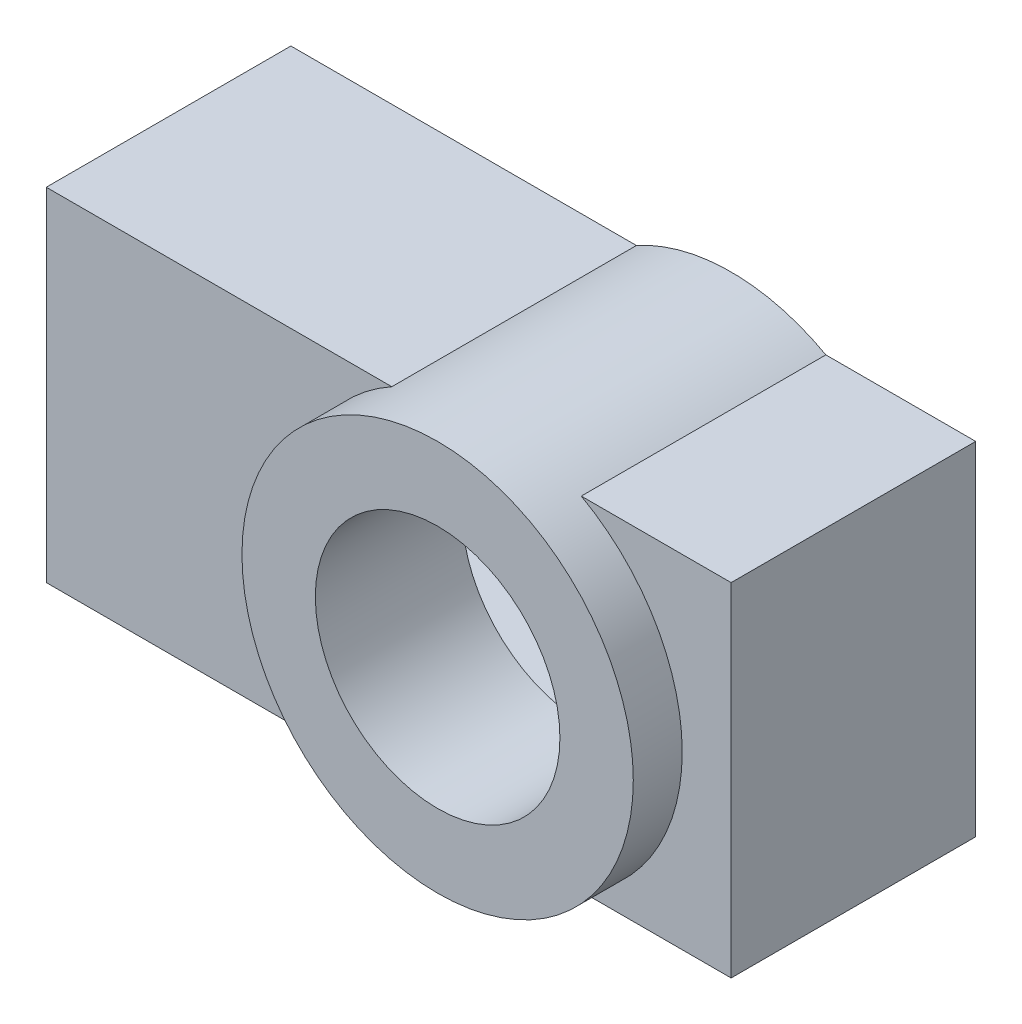
ISO-10303-21;
HEADER;
FILE_DESCRIPTION(('STEP AP214'),'2;1');
FILE_NAME('part.step','',(''),(''),'','','');
FILE_SCHEMA(('AUTOMOTIVE_DESIGN { 1 0 10303 214 1 1 1 1 }'));
ENDSEC;
DATA;
#1=APPLICATION_CONTEXT('core data for automotive mechanical design processes');
#2=APPLICATION_PROTOCOL_DEFINITION('international standard','automotive_design',2000,#1);
#3=PRODUCT_CONTEXT('',#1,'mechanical');
#4=PRODUCT('Part','Part','',(#3));
#5=PRODUCT_RELATED_PRODUCT_CATEGORY('part','',(#4));
#6=PRODUCT_DEFINITION_FORMATION('','',#4);
#7=PRODUCT_DEFINITION_CONTEXT('part definition',#1,'design');
#8=PRODUCT_DEFINITION('design','',#6,#7);
#9=PRODUCT_DEFINITION_SHAPE('','',#8);
#10=(LENGTH_UNIT() NAMED_UNIT(*) SI_UNIT(.MILLI.,.METRE.));
#11=(NAMED_UNIT(*) PLANE_ANGLE_UNIT() SI_UNIT($,.RADIAN.));
#12=(NAMED_UNIT(*) SI_UNIT($,.STERADIAN.) SOLID_ANGLE_UNIT());
#13=UNCERTAINTY_MEASURE_WITH_UNIT(LENGTH_MEASURE(1.E-05),#10,'distance_accuracy_value','');
#14=(GEOMETRIC_REPRESENTATION_CONTEXT(3) GLOBAL_UNCERTAINTY_ASSIGNED_CONTEXT((#13)) GLOBAL_UNIT_ASSIGNED_CONTEXT((#10,
#11,#12)) REPRESENTATION_CONTEXT('',''));
#15=CARTESIAN_POINT('',(0.,0.,0.));
#16=DIRECTION('',(0.,0.,1.));
#17=DIRECTION('',(1.,0.,0.));
#18=AXIS2_PLACEMENT_3D('',#15,#16,#17);
#19=CARTESIAN_POINT('',(14.,0.,-1.));
#20=DIRECTION('',(0.,0.,1.));
#21=DIRECTION('',(1.,0.,0.));
#22=AXIS2_PLACEMENT_3D('',#19,#20,#21);
#23=PLANE('',#22);
#24=DIRECTION('',(-1.,0.,0.));
#25=VECTOR('',#24,1.);
#26=CARTESIAN_POINT('',(14.,-2.5,-1.));
#27=LINE('',#26,#25);
#28=CARTESIAN_POINT('',(12.,-2.5,-1.));
#29=VERTEX_POINT('',#28);
#30=CARTESIAN_POINT('',(9.,-2.5,-0.999999999999999));
#31=VERTEX_POINT('',#30);
#32=EDGE_CURVE('E148',#29,#31,#27,.T.);
#33=ORIENTED_EDGE('',*,*,#32,.F.);
#34=DIRECTION('',(0.,1.,0.));
#35=VECTOR('',#34,1.);
#36=CARTESIAN_POINT('',(12.,2.5,-1.));
#37=LINE('',#36,#35);
#38=CARTESIAN_POINT('',(12.,2.5,-1.));
#39=VERTEX_POINT('',#38);
#40=EDGE_CURVE('E147',#29,#39,#37,.T.);
#41=ORIENTED_EDGE('',*,*,#40,.T.);
#42=DIRECTION('',(-1.,0.,0.));
#43=VECTOR('',#42,1.);
#44=CARTESIAN_POINT('',(14.,2.5,-1.));
#45=LINE('',#44,#43);
#46=CARTESIAN_POINT('',(9.,2.5,-0.999999999999999));
#47=VERTEX_POINT('',#46);
#48=EDGE_CURVE('E134',#39,#47,#45,.T.);
#49=ORIENTED_EDGE('',*,*,#48,.T.);
#50=CARTESIAN_POINT('',(9.,0.,-0.999999999999999));
#51=DIRECTION('',(0.,0.,-1.));
#52=DIRECTION('',(-1.,0.,0.));
#53=AXIS2_PLACEMENT_3D('',#50,#51,#52);
#54=CIRCLE('',#53,2.5);
#55=EDGE_CURVE('E155',#31,#47,#54,.F.);
#56=ORIENTED_EDGE('',*,*,#55,.F.);
#57=EDGE_LOOP('',(#33,#41,#49,#56));
#58=FACE_BOUND('',#57,.T.);
#59=ADVANCED_FACE('F34',(#58),#23,.T.);
#60=CARTESIAN_POINT('',(14.,-2.5,0.));
#61=DIRECTION('',(0.,1.,0.));
#62=DIRECTION('',(0.,0.,1.));
#63=AXIS2_PLACEMENT_3D('',#60,#61,#62);
#64=PLANE('',#63);
#65=DIRECTION('',(-1.,0.,0.));
#66=VECTOR('',#65,1.);
#67=CARTESIAN_POINT('',(14.,-2.5,1.));
#68=LINE('',#67,#66);
#69=CARTESIAN_POINT('',(12.,-2.5,1.));
#70=VERTEX_POINT('',#69);
#71=CARTESIAN_POINT('',(9.,-2.5,1.));
#72=VERTEX_POINT('',#71);
#73=EDGE_CURVE('E235',#70,#72,#68,.T.);
#74=ORIENTED_EDGE('',*,*,#73,.F.);
#75=DIRECTION('',(0.,0.,-1.));
#76=VECTOR('',#75,1.);
#77=CARTESIAN_POINT('',(12.,-2.5,1.));
#78=LINE('',#77,#76);
#79=EDGE_CURVE('E48',#70,#29,#78,.T.);
#80=ORIENTED_EDGE('',*,*,#79,.T.);
#81=ORIENTED_EDGE('',*,*,#32,.T.);
#82=CARTESIAN_POINT('',(0.,-2.5,-1.));
#83=VERTEX_POINT('',#82);
#84=EDGE_CURVE('E237',#31,#83,#27,.T.);
#85=ORIENTED_EDGE('',*,*,#84,.T.);
#86=DIRECTION('',(0.,0.,-1.));
#87=VECTOR('',#86,1.);
#88=CARTESIAN_POINT('',(0.,-2.5,0.));
#89=LINE('',#88,#87);
#90=CARTESIAN_POINT('',(0.,-2.5,1.));
#91=VERTEX_POINT('',#90);
#92=EDGE_CURVE('E196',#91,#83,#89,.T.);
#93=ORIENTED_EDGE('',*,*,#92,.F.);
#94=EDGE_CURVE('E234',#72,#91,#68,.T.);
#95=ORIENTED_EDGE('',*,*,#94,.F.);
#96=EDGE_LOOP('',(#74,#80,#81,#85,#93,#95));
#97=FACE_BOUND('',#96,.T.);
#98=ADVANCED_FACE('F291',(#97),#64,.T.);
#99=CARTESIAN_POINT('',(14.,0.,1.));
#100=DIRECTION('',(0.,0.,1.));
#101=DIRECTION('',(1.,0.,0.));
#102=AXIS2_PLACEMENT_3D('',#99,#100,#101);
#103=PLANE('',#102);
#104=DIRECTION('',(0.,-1.,0.));
#105=VECTOR('',#104,1.);
#106=CARTESIAN_POINT('',(12.,2.5,1.));
#107=LINE('',#106,#105);
#108=CARTESIAN_POINT('',(12.,2.5,1.));
#109=VERTEX_POINT('',#108);
#110=EDGE_CURVE('E56',#109,#70,#107,.T.);
#111=ORIENTED_EDGE('',*,*,#110,.T.);
#112=ORIENTED_EDGE('',*,*,#73,.T.);
#113=CARTESIAN_POINT('',(9.,0.,1.));
#114=DIRECTION('',(0.,0.,1.));
#115=DIRECTION('',(1.,0.,0.));
#116=AXIS2_PLACEMENT_3D('',#113,#114,#115);
#117=CIRCLE('',#116,2.5);
#118=CARTESIAN_POINT('',(9.,2.5,1.));
#119=VERTEX_POINT('',#118);
#120=EDGE_CURVE('E159',#119,#72,#117,.F.);
#121=ORIENTED_EDGE('',*,*,#120,.F.);
#122=DIRECTION('',(-1.,0.,0.));
#123=VECTOR('',#122,1.);
#124=CARTESIAN_POINT('',(14.,2.5,1.));
#125=LINE('',#124,#123);
#126=EDGE_CURVE('E232',#109,#119,#125,.T.);
#127=ORIENTED_EDGE('',*,*,#126,.F.);
#128=EDGE_LOOP('',(#111,#112,#121,#127));
#129=FACE_BOUND('',#128,.T.);
#130=ADVANCED_FACE('F296',(#129),#103,.F.);
#131=CARTESIAN_POINT('',(14.,2.5,0.));
#132=DIRECTION('',(0.,1.,0.));
#133=DIRECTION('',(0.,0.,1.));
#134=AXIS2_PLACEMENT_3D('',#131,#132,#133);
#135=PLANE('',#134);
#136=DIRECTION('',(0.,0.,1.));
#137=VECTOR('',#136,1.);
#138=CARTESIAN_POINT('',(12.,2.5,1.));
#139=LINE('',#138,#137);
#140=EDGE_CURVE('E138',#39,#109,#139,.T.);
#141=ORIENTED_EDGE('',*,*,#140,.T.);
#142=ORIENTED_EDGE('',*,*,#126,.T.);
#143=CARTESIAN_POINT('',(0.,2.5,1.));
#144=VERTEX_POINT('',#143);
#145=EDGE_CURVE('E144',#119,#144,#125,.T.);
#146=ORIENTED_EDGE('',*,*,#145,.T.);
#147=DIRECTION('',(0.,0.,-1.));
#148=VECTOR('',#147,1.);
#149=CARTESIAN_POINT('',(0.,2.5,0.));
#150=LINE('',#149,#148);
#151=CARTESIAN_POINT('',(0.,2.5,-1.));
#152=VERTEX_POINT('',#151);
#153=EDGE_CURVE('E202',#144,#152,#150,.T.);
#154=ORIENTED_EDGE('',*,*,#153,.T.);
#155=EDGE_CURVE('E140',#47,#152,#45,.T.);
#156=ORIENTED_EDGE('',*,*,#155,.F.);
#157=ORIENTED_EDGE('',*,*,#48,.F.);
#158=EDGE_LOOP('',(#141,#142,#146,#154,#156,#157));
#159=FACE_BOUND('',#158,.T.);
#160=ADVANCED_FACE('F136',(#159),#135,.F.);
#161=CARTESIAN_POINT('',(9.,0.,-11.));
#162=DIRECTION('',(0.,0.,1.));
#163=DIRECTION('',(1.,0.,0.));
#164=AXIS2_PLACEMENT_3D('',#161,#162,#163);
#165=CYLINDRICAL_SURFACE('',#164,2.5);
#166=EDGE_CURVE('E152',#47,#31,#54,.F.);
#167=ORIENTED_EDGE('',*,*,#166,.T.);
#168=ORIENTED_EDGE('',*,*,#55,.T.);
#169=EDGE_LOOP('',(#167,#168));
#170=FACE_BOUND('',#169,.T.);
#171=CARTESIAN_POINT('',(9.,0.,-1.5));
#172=DIRECTION('',(0.,0.,-1.));
#173=DIRECTION('',(-1.,0.,0.));
#174=AXIS2_PLACEMENT_3D('',#171,#172,#173);
#175=CIRCLE('',#174,2.5);
#176=CARTESIAN_POINT('',(6.5,0.,-1.5));
#177=VERTEX_POINT('',#176);
#178=EDGE_CURVE('E11',#177,#177,#175,.F.);
#179=ORIENTED_EDGE('',*,*,#178,.F.);
#180=EDGE_LOOP('',(#179));
#181=FACE_BOUND('',#180,.T.);
#182=ADVANCED_FACE('F311',(#170,#181),#165,.F.);
#183=CARTESIAN_POINT('',(9.,0.,4.));
#184=DIRECTION('',(0.,0.,1.));
#185=DIRECTION('',(1.,0.,0.));
#186=AXIS2_PLACEMENT_3D('',#183,#184,#185);
#187=CIRCLE('',#186,2.5);
#188=CARTESIAN_POINT('',(11.5,0.,4.));
#189=VERTEX_POINT('',#188);
#190=EDGE_CURVE('E163',#189,#189,#187,.T.);
#191=ORIENTED_EDGE('',*,*,#190,.T.);
#192=EDGE_LOOP('',(#191));
#193=FACE_BOUND('',#192,.T.);
#194=ORIENTED_EDGE('',*,*,#120,.T.);
#195=EDGE_CURVE('E162',#72,#119,#117,.F.);
#196=ORIENTED_EDGE('',*,*,#195,.T.);
#197=EDGE_LOOP('',(#194,#196));
#198=FACE_BOUND('',#197,.T.);
#199=ADVANCED_FACE('F314',(#193,#198),#165,.F.);
#200=CARTESIAN_POINT('',(14.,-3.5,0.));
#201=DIRECTION('',(0.,1.,0.));
#202=DIRECTION('',(0.,0.,1.));
#203=AXIS2_PLACEMENT_3D('',#200,#201,#202);
#204=PLANE('',#203);
#205=DIRECTION('',(-1.,0.,0.));
#206=VECTOR('',#205,1.);
#207=CARTESIAN_POINT('',(14.,-3.5,-2.));
#208=LINE('',#207,#206);
#209=CARTESIAN_POINT('',(7.06350832689629,-3.5,-2.));
#210=VERTEX_POINT('',#209);
#211=CARTESIAN_POINT('',(0.,-3.5,-2.));
#212=VERTEX_POINT('',#211);
#213=EDGE_CURVE('E227',#210,#212,#208,.T.);
#214=ORIENTED_EDGE('',*,*,#213,.F.);
#215=DIRECTION('',(0.,0.,1.));
#216=VECTOR('',#215,1.);
#217=CARTESIAN_POINT('',(7.06350832689629,-3.5,-2.));
#218=LINE('',#217,#216);
#219=CARTESIAN_POINT('',(7.06350832689629,-3.5,3.));
#220=VERTEX_POINT('',#219);
#221=EDGE_CURVE('E174',#210,#220,#218,.T.);
#222=ORIENTED_EDGE('',*,*,#221,.T.);
#223=DIRECTION('',(-1.,0.,0.));
#224=VECTOR('',#223,1.);
#225=CARTESIAN_POINT('',(14.,-3.5,3.));
#226=LINE('',#225,#224);
#227=CARTESIAN_POINT('',(0.,-3.5,3.));
#228=VERTEX_POINT('',#227);
#229=EDGE_CURVE('E219',#220,#228,#226,.T.);
#230=ORIENTED_EDGE('',*,*,#229,.T.);
#231=DIRECTION('',(0.,0.,-1.));
#232=VECTOR('',#231,1.);
#233=CARTESIAN_POINT('',(0.,-3.5,0.));
#234=LINE('',#233,#232);
#235=EDGE_CURVE('E204',#228,#212,#234,.T.);
#236=ORIENTED_EDGE('',*,*,#235,.T.);
#237=EDGE_LOOP('',(#214,#222,#230,#236));
#238=FACE_BOUND('',#237,.T.);
#239=ADVANCED_FACE('F272',(#238),#204,.F.);
#240=CARTESIAN_POINT('',(14.,3.5,0.));
#241=DIRECTION('',(0.,1.,0.));
#242=DIRECTION('',(0.,0.,1.));
#243=AXIS2_PLACEMENT_3D('',#240,#241,#242);
#244=PLANE('',#243);
#245=DIRECTION('',(0.,0.,1.));
#246=VECTOR('',#245,1.);
#247=CARTESIAN_POINT('',(7.06350832689629,3.5,-2.));
#248=LINE('',#247,#246);
#249=CARTESIAN_POINT('',(7.06350832689629,3.5,-2.));
#250=VERTEX_POINT('',#249);
#251=CARTESIAN_POINT('',(7.06350832689629,3.5,3.));
#252=VERTEX_POINT('',#251);
#253=EDGE_CURVE('E172',#250,#252,#248,.T.);
#254=ORIENTED_EDGE('',*,*,#253,.F.);
#255=DIRECTION('',(-1.,0.,0.));
#256=VECTOR('',#255,1.);
#257=CARTESIAN_POINT('',(14.,3.5,-2.));
#258=LINE('',#257,#256);
#259=CARTESIAN_POINT('',(0.,3.5,-2.));
#260=VERTEX_POINT('',#259);
#261=EDGE_CURVE('E223',#250,#260,#258,.T.);
#262=ORIENTED_EDGE('',*,*,#261,.T.);
#263=DIRECTION('',(0.,0.,-1.));
#264=VECTOR('',#263,1.);
#265=CARTESIAN_POINT('',(0.,3.5,0.));
#266=LINE('',#265,#264);
#267=CARTESIAN_POINT('',(0.,3.5,3.));
#268=VERTEX_POINT('',#267);
#269=EDGE_CURVE('E210',#268,#260,#266,.T.);
#270=ORIENTED_EDGE('',*,*,#269,.F.);
#271=DIRECTION('',(-1.,0.,0.));
#272=VECTOR('',#271,1.);
#273=CARTESIAN_POINT('',(14.,3.5,3.));
#274=LINE('',#273,#272);
#275=EDGE_CURVE('E218',#252,#268,#274,.T.);
#276=ORIENTED_EDGE('',*,*,#275,.F.);
#277=EDGE_LOOP('',(#254,#262,#270,#276));
#278=FACE_BOUND('',#277,.T.);
#279=ADVANCED_FACE('F268',(#278),#244,.T.);
#280=CARTESIAN_POINT('',(14.,0.,3.));
#281=DIRECTION('',(0.,0.,-1.));
#282=DIRECTION('',(0.,1.,0.));
#283=AXIS2_PLACEMENT_3D('',#280,#281,#282);
#284=PLANE('',#283);
#285=CARTESIAN_POINT('',(14.,3.5,3.));
#286=VERTEX_POINT('',#285);
#287=CARTESIAN_POINT('',(10.9364916731037,3.5,3.));
#288=VERTEX_POINT('',#287);
#289=EDGE_CURVE('E220',#286,#288,#274,.T.);
#290=ORIENTED_EDGE('',*,*,#289,.T.);
#291=CARTESIAN_POINT('',(9.,0.,3.));
#292=DIRECTION('',(0.,0.,-1.));
#293=DIRECTION('',(0.,1.,0.));
#294=AXIS2_PLACEMENT_3D('',#291,#292,#293);
#295=CIRCLE('',#294,4.);
#296=CARTESIAN_POINT('',(10.9364916731037,-3.5,3.));
#297=VERTEX_POINT('',#296);
#298=EDGE_CURVE('E41',#288,#297,#295,.T.);
#299=ORIENTED_EDGE('',*,*,#298,.T.);
#300=CARTESIAN_POINT('',(14.,-3.5,3.));
#301=VERTEX_POINT('',#300);
#302=EDGE_CURVE('E215',#301,#297,#226,.T.);
#303=ORIENTED_EDGE('',*,*,#302,.F.);
#304=DIRECTION('',(0.,-1.,0.));
#305=VECTOR('',#304,1.);
#306=CARTESIAN_POINT('',(14.,0.,3.));
#307=LINE('',#306,#305);
#308=EDGE_CURVE('E192',#286,#301,#307,.T.);
#309=ORIENTED_EDGE('',*,*,#308,.F.);
#310=EDGE_LOOP('',(#290,#299,#303,#309));
#311=FACE_BOUND('',#310,.T.);
#312=ADVANCED_FACE('F245',(#311),#284,.F.);
#313=ORIENTED_EDGE('',*,*,#84,.F.);
#314=ORIENTED_EDGE('',*,*,#166,.F.);
#315=ORIENTED_EDGE('',*,*,#155,.T.);
#316=DIRECTION('',(0.,1.,0.));
#317=VECTOR('',#316,1.);
#318=CARTESIAN_POINT('',(0.,0.,-1.));
#319=LINE('',#318,#317);
#320=EDGE_CURVE('E182',#83,#152,#319,.T.);
#321=ORIENTED_EDGE('',*,*,#320,.F.);
#322=EDGE_LOOP('',(#313,#314,#315,#321));
#323=FACE_BOUND('',#322,.T.);
#324=ADVANCED_FACE('F292',(#323),#23,.T.);
#325=ORIENTED_EDGE('',*,*,#145,.F.);
#326=ORIENTED_EDGE('',*,*,#195,.F.);
#327=ORIENTED_EDGE('',*,*,#94,.T.);
#328=DIRECTION('',(0.,1.,0.));
#329=VECTOR('',#328,1.);
#330=CARTESIAN_POINT('',(0.,0.,1.));
#331=LINE('',#330,#329);
#332=EDGE_CURVE('E199',#91,#144,#331,.T.);
#333=ORIENTED_EDGE('',*,*,#332,.T.);
#334=EDGE_LOOP('',(#325,#326,#327,#333));
#335=FACE_BOUND('',#334,.T.);
#336=ADVANCED_FACE('F298',(#335),#103,.F.);
#337=ORIENTED_EDGE('',*,*,#302,.T.);
#338=DIRECTION('',(0.,0.,1.));
#339=VECTOR('',#338,1.);
#340=CARTESIAN_POINT('',(10.9364916731037,-3.5,-2.));
#341=LINE('',#340,#339);
#342=CARTESIAN_POINT('',(10.9364916731037,-3.5,-2.));
#343=VERTEX_POINT('',#342);
#344=EDGE_CURVE('E179',#297,#343,#341,.F.);
#345=ORIENTED_EDGE('',*,*,#344,.T.);
#346=CARTESIAN_POINT('',(14.,-3.5,-2.));
#347=VERTEX_POINT('',#346);
#348=EDGE_CURVE('E228',#347,#343,#208,.T.);
#349=ORIENTED_EDGE('',*,*,#348,.F.);
#350=DIRECTION('',(0.,0.,-1.));
#351=VECTOR('',#350,1.);
#352=CARTESIAN_POINT('',(14.,-3.5,0.));
#353=LINE('',#352,#351);
#354=EDGE_CURVE('E183',#301,#347,#353,.T.);
#355=ORIENTED_EDGE('',*,*,#354,.F.);
#356=EDGE_LOOP('',(#337,#345,#349,#355));
#357=FACE_BOUND('',#356,.T.);
#358=ADVANCED_FACE('F251',(#357),#204,.F.);
#359=CARTESIAN_POINT('',(14.,0.,-2.));
#360=DIRECTION('',(0.,0.,1.));
#361=DIRECTION('',(1.,0.,0.));
#362=AXIS2_PLACEMENT_3D('',#359,#360,#361);
#363=PLANE('',#362);
#364=ORIENTED_EDGE('',*,*,#348,.T.);
#365=CARTESIAN_POINT('',(9.,0.,-2.));
#366=DIRECTION('',(0.,0.,1.));
#367=DIRECTION('',(1.,0.,0.));
#368=AXIS2_PLACEMENT_3D('',#365,#366,#367);
#369=CIRCLE('',#368,4.);
#370=EDGE_CURVE('E169',#210,#343,#369,.T.);
#371=ORIENTED_EDGE('',*,*,#370,.F.);
#372=ORIENTED_EDGE('',*,*,#213,.T.);
#373=DIRECTION('',(0.,1.,0.));
#374=VECTOR('',#373,1.);
#375=CARTESIAN_POINT('',(0.,0.,-2.));
#376=LINE('',#375,#374);
#377=EDGE_CURVE('E207',#212,#260,#376,.T.);
#378=ORIENTED_EDGE('',*,*,#377,.T.);
#379=ORIENTED_EDGE('',*,*,#261,.F.);
#380=CARTESIAN_POINT('',(10.9364916731037,3.5,-2.));
#381=VERTEX_POINT('',#380);
#382=EDGE_CURVE('E170',#381,#250,#369,.T.);
#383=ORIENTED_EDGE('',*,*,#382,.F.);
#384=CARTESIAN_POINT('',(14.,3.5,-2.));
#385=VERTEX_POINT('',#384);
#386=EDGE_CURVE('E224',#385,#381,#258,.T.);
#387=ORIENTED_EDGE('',*,*,#386,.F.);
#388=DIRECTION('',(0.,1.,0.));
#389=VECTOR('',#388,1.);
#390=CARTESIAN_POINT('',(14.,0.,-2.));
#391=LINE('',#390,#389);
#392=EDGE_CURVE('E186',#347,#385,#391,.T.);
#393=ORIENTED_EDGE('',*,*,#392,.F.);
#394=EDGE_LOOP('',(#364,#371,#372,#378,#379,#383,#387,#393));
#395=FACE_BOUND('',#394,.T.);
#396=ADVANCED_FACE('F264',(#395),#363,.F.);
#397=DIRECTION('',(0.,0.,1.));
#398=VECTOR('',#397,1.);
#399=CARTESIAN_POINT('',(10.9364916731037,3.5,-2.));
#400=LINE('',#399,#398);
#401=EDGE_CURVE('E177',#288,#381,#400,.F.);
#402=ORIENTED_EDGE('',*,*,#401,.F.);
#403=ORIENTED_EDGE('',*,*,#289,.F.);
#404=DIRECTION('',(0.,0.,-1.));
#405=VECTOR('',#404,1.);
#406=CARTESIAN_POINT('',(14.,3.5,0.));
#407=LINE('',#406,#405);
#408=EDGE_CURVE('E189',#286,#385,#407,.T.);
#409=ORIENTED_EDGE('',*,*,#408,.T.);
#410=ORIENTED_EDGE('',*,*,#386,.T.);
#411=EDGE_LOOP('',(#402,#403,#409,#410));
#412=FACE_BOUND('',#411,.T.);
#413=ADVANCED_FACE('F258',(#412),#244,.T.);
#414=ORIENTED_EDGE('',*,*,#229,.F.);
#415=EDGE_CURVE('E230',#220,#252,#295,.T.);
#416=ORIENTED_EDGE('',*,*,#415,.T.);
#417=ORIENTED_EDGE('',*,*,#275,.T.);
#418=DIRECTION('',(0.,-1.,0.));
#419=VECTOR('',#418,1.);
#420=CARTESIAN_POINT('',(0.,0.,3.));
#421=LINE('',#420,#419);
#422=EDGE_CURVE('E187',#268,#228,#421,.T.);
#423=ORIENTED_EDGE('',*,*,#422,.T.);
#424=EDGE_LOOP('',(#414,#416,#417,#423));
#425=FACE_BOUND('',#424,.T.);
#426=ADVANCED_FACE('F273',(#425),#284,.F.);
#427=CARTESIAN_POINT('',(14.,0.,0.));
#428=DIRECTION('',(1.,0.,0.));
#429=DIRECTION('',(0.,0.,-1.));
#430=AXIS2_PLACEMENT_3D('',#427,#428,#429);
#431=PLANE('',#430);
#432=ORIENTED_EDGE('',*,*,#354,.T.);
#433=ORIENTED_EDGE('',*,*,#392,.T.);
#434=ORIENTED_EDGE('',*,*,#408,.F.);
#435=ORIENTED_EDGE('',*,*,#308,.T.);
#436=EDGE_LOOP('',(#432,#433,#434,#435));
#437=FACE_BOUND('',#436,.T.);
#438=ADVANCED_FACE('F254',(#437),#431,.T.);
#439=CARTESIAN_POINT('',(0.,0.,0.));
#440=DIRECTION('',(1.,0.,0.));
#441=DIRECTION('',(0.,0.,-1.));
#442=AXIS2_PLACEMENT_3D('',#439,#440,#441);
#443=PLANE('',#442);
#444=ORIENTED_EDGE('',*,*,#320,.T.);
#445=ORIENTED_EDGE('',*,*,#153,.F.);
#446=ORIENTED_EDGE('',*,*,#332,.F.);
#447=ORIENTED_EDGE('',*,*,#92,.T.);
#448=EDGE_LOOP('',(#444,#445,#446,#447));
#449=FACE_BOUND('',#448,.T.);
#450=ORIENTED_EDGE('',*,*,#235,.F.);
#451=ORIENTED_EDGE('',*,*,#422,.F.);
#452=ORIENTED_EDGE('',*,*,#269,.T.);
#453=ORIENTED_EDGE('',*,*,#377,.F.);
#454=EDGE_LOOP('',(#450,#451,#452,#453));
#455=FACE_BOUND('',#454,.T.);
#456=ADVANCED_FACE('F277',(#449,#455),#443,.F.);
#457=CARTESIAN_POINT('',(9.,0.,4.));
#458=DIRECTION('',(0.,0.,1.));
#459=DIRECTION('',(1.,0.,0.));
#460=AXIS2_PLACEMENT_3D('',#457,#458,#459);
#461=PLANE('',#460);
#462=CARTESIAN_POINT('',(9.,0.,4.));
#463=DIRECTION('',(0.,0.,1.));
#464=DIRECTION('',(1.,0.,0.));
#465=AXIS2_PLACEMENT_3D('',#462,#463,#464);
#466=CIRCLE('',#465,4.);
#467=CARTESIAN_POINT('',(13.,0.,4.));
#468=VERTEX_POINT('',#467);
#469=EDGE_CURVE('E166',#468,#468,#466,.T.);
#470=ORIENTED_EDGE('',*,*,#469,.T.);
#471=EDGE_LOOP('',(#470));
#472=FACE_BOUND('',#471,.T.);
#473=ORIENTED_EDGE('',*,*,#190,.F.);
#474=EDGE_LOOP('',(#473));
#475=FACE_BOUND('',#474,.T.);
#476=ADVANCED_FACE('F279',(#472,#475),#461,.T.);
#477=CARTESIAN_POINT('',(9.,0.,-2.));
#478=DIRECTION('',(0.,0.,1.));
#479=DIRECTION('',(1.,0.,0.));
#480=AXIS2_PLACEMENT_3D('',#477,#478,#479);
#481=CYLINDRICAL_SURFACE('',#480,4.);
#482=ORIENTED_EDGE('',*,*,#469,.F.);
#483=EDGE_LOOP('',(#482));
#484=FACE_BOUND('',#483,.T.);
#485=ORIENTED_EDGE('',*,*,#344,.F.);
#486=ORIENTED_EDGE('',*,*,#298,.F.);
#487=ORIENTED_EDGE('',*,*,#401,.T.);
#488=ORIENTED_EDGE('',*,*,#382,.T.);
#489=ORIENTED_EDGE('',*,*,#253,.T.);
#490=ORIENTED_EDGE('',*,*,#415,.F.);
#491=ORIENTED_EDGE('',*,*,#221,.F.);
#492=ORIENTED_EDGE('',*,*,#370,.T.);
#493=EDGE_LOOP('',(#485,#486,#487,#488,#489,#490,#491,#492));
#494=FACE_BOUND('',#493,.T.);
#495=ADVANCED_FACE('F260',(#484,#494),#481,.T.);
#496=CARTESIAN_POINT('',(0.,0.,-1.5));
#497=DIRECTION('',(0.,0.,-1.));
#498=DIRECTION('',(-1.,0.,0.));
#499=AXIS2_PLACEMENT_3D('',#496,#497,#498);
#500=PLANE('',#499);
#501=ORIENTED_EDGE('',*,*,#178,.T.);
#502=EDGE_LOOP('',(#501));
#503=FACE_BOUND('',#502,.T.);
#504=ADVANCED_FACE('F318',(#503),#500,.F.);
#505=CARTESIAN_POINT('',(12.,0.,0.));
#506=DIRECTION('',(1.,0.,0.));
#507=DIRECTION('',(0.,0.,-1.));
#508=AXIS2_PLACEMENT_3D('',#505,#506,#507);
#509=PLANE('',#508);
#510=ORIENTED_EDGE('',*,*,#110,.F.);
#511=ORIENTED_EDGE('',*,*,#140,.F.);
#512=ORIENTED_EDGE('',*,*,#40,.F.);
#513=ORIENTED_EDGE('',*,*,#79,.F.);
#514=EDGE_LOOP('',(#510,#511,#512,#513));
#515=FACE_BOUND('',#514,.T.);
#516=ADVANCED_FACE('F151',(#515),#509,.F.);
#517=CLOSED_SHELL('',(#59,#98,#130,#160,#182,#199,#239,#279,#312,#324,#336,#358,#396,#413,#426,
#438,#456,#476,#495,#504,#516));
#518=MANIFOLD_SOLID_BREP('B2',#517);
#519=ADVANCED_BREP_SHAPE_REPRESENTATION('',(#18,#518),#14);
#520=SHAPE_DEFINITION_REPRESENTATION(#9,#519);
ENDSEC;
END-ISO-10303-21;
